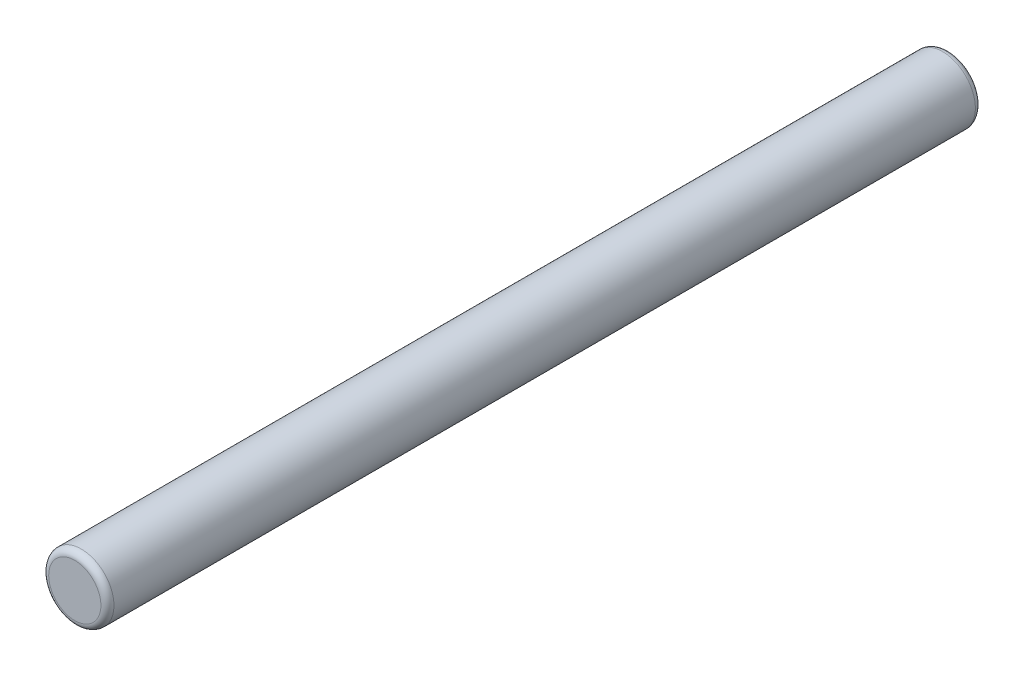
ISO-10303-21;
HEADER;
FILE_DESCRIPTION(('STEP AP214'),'2;1');
FILE_NAME('part.step','',(''),(''),'','','');
FILE_SCHEMA(('AUTOMOTIVE_DESIGN { 1 0 10303 214 1 1 1 1 }'));
ENDSEC;
DATA;
#1=APPLICATION_CONTEXT('core data for automotive mechanical design processes');
#2=APPLICATION_PROTOCOL_DEFINITION('international standard','automotive_design',2000,#1);
#3=PRODUCT_CONTEXT('',#1,'mechanical');
#4=PRODUCT('Part','Part','',(#3));
#5=PRODUCT_RELATED_PRODUCT_CATEGORY('part','',(#4));
#6=PRODUCT_DEFINITION_FORMATION('','',#4);
#7=PRODUCT_DEFINITION_CONTEXT('part definition',#1,'design');
#8=PRODUCT_DEFINITION('design','',#6,#7);
#9=PRODUCT_DEFINITION_SHAPE('','',#8);
#10=(LENGTH_UNIT() NAMED_UNIT(*) SI_UNIT(.MILLI.,.METRE.));
#11=(NAMED_UNIT(*) PLANE_ANGLE_UNIT() SI_UNIT($,.RADIAN.));
#12=(NAMED_UNIT(*) SI_UNIT($,.STERADIAN.) SOLID_ANGLE_UNIT());
#13=UNCERTAINTY_MEASURE_WITH_UNIT(LENGTH_MEASURE(1.E-05),#10,'distance_accuracy_value','');
#14=(GEOMETRIC_REPRESENTATION_CONTEXT(3) GLOBAL_UNCERTAINTY_ASSIGNED_CONTEXT((#13)) GLOBAL_UNIT_ASSIGNED_CONTEXT((#10,
#11,#12)) REPRESENTATION_CONTEXT('',''));
#15=CARTESIAN_POINT('',(0.,0.,0.));
#16=DIRECTION('',(0.,0.,1.));
#17=DIRECTION('',(1.,0.,0.));
#18=AXIS2_PLACEMENT_3D('',#15,#16,#17);
#19=CARTESIAN_POINT('',(0.,0.,6.65));
#20=DIRECTION('',(0.,0.,-1.));
#21=DIRECTION('',(-1.,0.,0.));
#22=AXIS2_PLACEMENT_3D('',#19,#20,#21);
#23=TOROIDAL_SURFACE('',#22,0.2,0.05);
#24=CARTESIAN_POINT('',(0.,0.,6.65));
#25=DIRECTION('',(0.,0.,-1.));
#26=DIRECTION('',(-1.,0.,0.));
#27=AXIS2_PLACEMENT_3D('',#24,#25,#26);
#28=CIRCLE('',#27,0.25);
#29=CARTESIAN_POINT('',(-0.25,0.,6.65));
#30=VERTEX_POINT('',#29);
#31=EDGE_CURVE('E11',#30,#30,#28,.T.);
#32=ORIENTED_EDGE('',*,*,#31,.F.);
#33=CARTESIAN_POINT('',(-0.2,0.,6.7));
#34=CARTESIAN_POINT('',(-0.215707963267948,0.,6.69999999999998));
#35=CARTESIAN_POINT('',(-0.231430582168145,0.,6.69384924979774));
#36=CARTESIAN_POINT('',(-0.243849249797713,0.,6.68143058216813));
#37=CARTESIAN_POINT('',(-0.25,0.,6.66570796326795));
#38=CARTESIAN_POINT('',(-0.25,0.,6.65));
#39=B_SPLINE_CURVE_WITH_KNOTS('',5,(#33,#34,#35,#36,#37,#38),.UNSPECIFIED.,.F.,.F.,(6,6),
(-1.5707963267949,0.),.UNSPECIFIED.);
#40=CARTESIAN_POINT('',(-0.2,0.,6.7));
#41=VERTEX_POINT('',#40);
#42=EDGE_CURVE('E23',#41,#30,#39,.T.);
#43=ORIENTED_EDGE('',*,*,#42,.F.);
#44=CARTESIAN_POINT('',(0.,0.,6.7));
#45=DIRECTION('',(0.,0.,-1.));
#46=DIRECTION('',(-1.,0.,0.));
#47=AXIS2_PLACEMENT_3D('',#44,#45,#46);
#48=CIRCLE('',#47,0.2);
#49=EDGE_CURVE('E49',#41,#41,#48,.T.);
#50=ORIENTED_EDGE('',*,*,#49,.T.);
#51=ORIENTED_EDGE('',*,*,#42,.T.);
#52=EDGE_LOOP('',(#32,#43,#50,#51));
#53=FACE_BOUND('',#52,.T.);
#54=ADVANCED_FACE('F16',(#53),#23,.T.);
#55=CARTESIAN_POINT('',(0.,0.,0.05));
#56=DIRECTION('',(0.,0.,-1.));
#57=DIRECTION('',(-1.,0.,0.));
#58=AXIS2_PLACEMENT_3D('',#55,#56,#57);
#59=TOROIDAL_SURFACE('',#58,0.2,0.05);
#60=CARTESIAN_POINT('',(0.,0.,0.));
#61=DIRECTION('',(0.,0.,-1.));
#62=DIRECTION('',(-1.,0.,0.));
#63=AXIS2_PLACEMENT_3D('',#60,#61,#62);
#64=CIRCLE('',#63,0.2);
#65=CARTESIAN_POINT('',(-0.2,0.,0.));
#66=VERTEX_POINT('',#65);
#67=EDGE_CURVE('E47',#66,#66,#64,.T.);
#68=ORIENTED_EDGE('',*,*,#67,.F.);
#69=CARTESIAN_POINT('',(-0.25,0.,0.05));
#70=CARTESIAN_POINT('',(-0.249999999999999,0.,0.034292036732051));
#71=CARTESIAN_POINT('',(-0.243849249797714,0.,0.0185694178318551));
#72=CARTESIAN_POINT('',(-0.231430582168144,0.,0.00615075020228677));
#73=CARTESIAN_POINT('',(-0.215707963267949,0.,0.));
#74=CARTESIAN_POINT('',(-0.2,0.,0.));
#75=B_SPLINE_CURVE_WITH_KNOTS('',5,(#69,#70,#71,#72,#73,#74),.UNSPECIFIED.,.F.,.F.,(6,6),(0.,
1.5707963267949),.UNSPECIFIED.);
#76=CARTESIAN_POINT('',(-0.25,0.,0.05));
#77=VERTEX_POINT('',#76);
#78=EDGE_CURVE('E43',#77,#66,#75,.T.);
#79=ORIENTED_EDGE('',*,*,#78,.F.);
#80=CARTESIAN_POINT('',(0.,0.,0.05));
#81=DIRECTION('',(0.,0.,-1.));
#82=DIRECTION('',(-1.,0.,0.));
#83=AXIS2_PLACEMENT_3D('',#80,#81,#82);
#84=CIRCLE('',#83,0.25);
#85=EDGE_CURVE('E46',#77,#77,#84,.T.);
#86=ORIENTED_EDGE('',*,*,#85,.T.);
#87=ORIENTED_EDGE('',*,*,#78,.T.);
#88=EDGE_LOOP('',(#68,#79,#86,#87));
#89=FACE_BOUND('',#88,.T.);
#90=ADVANCED_FACE('F44',(#89),#59,.T.);
#91=CARTESIAN_POINT('',(0.,0.,6.7));
#92=DIRECTION('',(0.,0.,1.));
#93=DIRECTION('',(0.,1.,0.));
#94=AXIS2_PLACEMENT_3D('',#91,#92,#93);
#95=CYLINDRICAL_SURFACE('',#94,0.25);
#96=ORIENTED_EDGE('',*,*,#85,.F.);
#97=CARTESIAN_POINT('',(-0.25,0.,0.0499999999999998));
#98=CARTESIAN_POINT('',(-0.25,0.,6.65));
#99=B_SPLINE_CURVE_WITH_KNOTS('',1,(#97,#98),.UNSPECIFIED.,.F.,.F.,(2,2),(-6.65,
-0.0499999999999998),.UNSPECIFIED.);
#100=EDGE_CURVE('E51',#77,#30,#99,.T.);
#101=ORIENTED_EDGE('',*,*,#100,.T.);
#102=ORIENTED_EDGE('',*,*,#31,.T.);
#103=ORIENTED_EDGE('',*,*,#100,.F.);
#104=EDGE_LOOP('',(#96,#101,#102,#103));
#105=FACE_BOUND('',#104,.T.);
#106=ADVANCED_FACE('F66',(#105),#95,.T.);
#107=CARTESIAN_POINT('',(0.,0.,6.7));
#108=DIRECTION('',(0.,0.,-1.));
#109=DIRECTION('',(-1.,0.,0.));
#110=AXIS2_PLACEMENT_3D('',#107,#108,#109);
#111=PLANE('',#110);
#112=ORIENTED_EDGE('',*,*,#49,.F.);
#113=EDGE_LOOP('',(#112));
#114=FACE_BOUND('',#113,.T.);
#115=ADVANCED_FACE('F73',(#114),#111,.F.);
#116=CARTESIAN_POINT('',(0.,0.,0.));
#117=DIRECTION('',(0.,0.,-1.));
#118=DIRECTION('',(-1.,0.,0.));
#119=AXIS2_PLACEMENT_3D('',#116,#117,#118);
#120=PLANE('',#119);
#121=ORIENTED_EDGE('',*,*,#67,.T.);
#122=EDGE_LOOP('',(#121));
#123=FACE_BOUND('',#122,.T.);
#124=ADVANCED_FACE('F80',(#123),#120,.T.);
#125=CLOSED_SHELL('',(#54,#90,#106,#115,#124));
#126=MANIFOLD_SOLID_BREP('B1',#125);
#127=ADVANCED_BREP_SHAPE_REPRESENTATION('',(#18,#126),#14);
#128=SHAPE_DEFINITION_REPRESENTATION(#9,#127);
ENDSEC;
END-ISO-10303-21;
